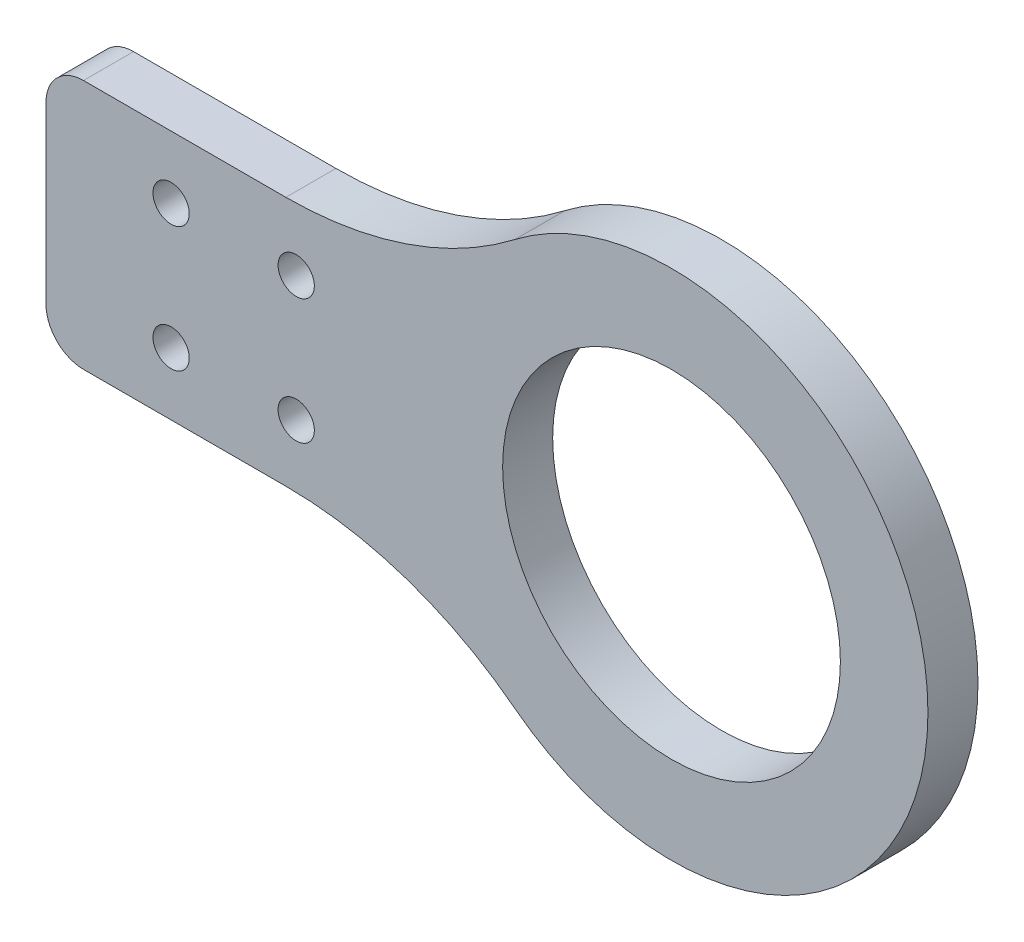
ISO-10303-21;
HEADER;
FILE_DESCRIPTION(('STEP AP214'),'2;1');
FILE_NAME('part.step','',(''),(''),'','','');
FILE_SCHEMA(('AUTOMOTIVE_DESIGN { 1 0 10303 214 1 1 1 1 }'));
ENDSEC;
DATA;
#1=APPLICATION_CONTEXT('core data for automotive mechanical design processes');
#2=APPLICATION_PROTOCOL_DEFINITION('international standard','automotive_design',2000,#1);
#3=PRODUCT_CONTEXT('',#1,'mechanical');
#4=PRODUCT('Part','Part','',(#3));
#5=PRODUCT_RELATED_PRODUCT_CATEGORY('part','',(#4));
#6=PRODUCT_DEFINITION_FORMATION('','',#4);
#7=PRODUCT_DEFINITION_CONTEXT('part definition',#1,'design');
#8=PRODUCT_DEFINITION('design','',#6,#7);
#9=PRODUCT_DEFINITION_SHAPE('','',#8);
#10=(LENGTH_UNIT() NAMED_UNIT(*) SI_UNIT(.MILLI.,.METRE.));
#11=(NAMED_UNIT(*) PLANE_ANGLE_UNIT() SI_UNIT($,.RADIAN.));
#12=(NAMED_UNIT(*) SI_UNIT($,.STERADIAN.) SOLID_ANGLE_UNIT());
#13=UNCERTAINTY_MEASURE_WITH_UNIT(LENGTH_MEASURE(1.E-05),#10,'distance_accuracy_value','');
#14=(GEOMETRIC_REPRESENTATION_CONTEXT(3) GLOBAL_UNCERTAINTY_ASSIGNED_CONTEXT((#13)) GLOBAL_UNIT_ASSIGNED_CONTEXT((#10,
#11,#12)) REPRESENTATION_CONTEXT('',''));
#15=CARTESIAN_POINT('',(0.,0.,0.));
#16=DIRECTION('',(0.,0.,1.));
#17=DIRECTION('',(1.,0.,0.));
#18=AXIS2_PLACEMENT_3D('',#15,#16,#17);
#19=CARTESIAN_POINT('',(17.8955301681733,-9.99999999999999,4.));
#20=DIRECTION('',(0.,0.,1.));
#21=DIRECTION('',(1.,0.,0.));
#22=AXIS2_PLACEMENT_3D('',#19,#20,#21);
#23=PLANE('',#22);
#24=CARTESIAN_POINT('',(-22.1044698318267,-15.,4.));
#25=DIRECTION('',(0.,0.,1.));
#26=DIRECTION('',(1.,0.,0.));
#27=AXIS2_PLACEMENT_3D('',#24,#25,#26);
#28=CIRCLE('',#27,1.45);
#29=CARTESIAN_POINT('',(-20.6544698318267,-15.,4.));
#30=VERTEX_POINT('',#29);
#31=EDGE_CURVE('E205',#30,#30,#28,.T.);
#32=ORIENTED_EDGE('',*,*,#31,.F.);
#33=EDGE_LOOP('',(#32));
#34=FACE_BOUND('',#33,.T.);
#35=CARTESIAN_POINT('',(-12.1044698318267,-15.,4.));
#36=DIRECTION('',(0.,0.,1.));
#37=DIRECTION('',(1.,0.,0.));
#38=AXIS2_PLACEMENT_3D('',#35,#36,#37);
#39=CIRCLE('',#38,1.45);
#40=CARTESIAN_POINT('',(-10.6544698318267,-15.,4.));
#41=VERTEX_POINT('',#40);
#42=EDGE_CURVE('E211',#41,#41,#39,.T.);
#43=ORIENTED_EDGE('',*,*,#42,.F.);
#44=EDGE_LOOP('',(#43));
#45=FACE_BOUND('',#44,.T.);
#46=CARTESIAN_POINT('',(-12.1044698318267,-5.,4.));
#47=DIRECTION('',(0.,0.,1.));
#48=DIRECTION('',(1.,0.,0.));
#49=AXIS2_PLACEMENT_3D('',#46,#47,#48);
#50=CIRCLE('',#49,1.45);
#51=CARTESIAN_POINT('',(-10.6544698318267,-5.,4.));
#52=VERTEX_POINT('',#51);
#53=EDGE_CURVE('E199',#52,#52,#50,.T.);
#54=ORIENTED_EDGE('',*,*,#53,.F.);
#55=EDGE_LOOP('',(#54));
#56=FACE_BOUND('',#55,.T.);
#57=CARTESIAN_POINT('',(-22.1044698318267,-5.,4.));
#58=DIRECTION('',(0.,0.,1.));
#59=DIRECTION('',(1.,0.,0.));
#60=AXIS2_PLACEMENT_3D('',#57,#58,#59);
#61=CIRCLE('',#60,1.45);
#62=CARTESIAN_POINT('',(-20.6544698318267,-5.,4.));
#63=VERTEX_POINT('',#62);
#64=EDGE_CURVE('E196',#63,#63,#61,.T.);
#65=ORIENTED_EDGE('',*,*,#64,.F.);
#66=EDGE_LOOP('',(#65));
#67=FACE_BOUND('',#66,.T.);
#68=DIRECTION('',(0.,-1.,0.));
#69=VECTOR('',#68,1.);
#70=CARTESIAN_POINT('',(-32.1044698318267,0.,4.));
#71=LINE('',#70,#69);
#72=CARTESIAN_POINT('',(-32.1044698318267,-3.,4.));
#73=VERTEX_POINT('',#72);
#74=CARTESIAN_POINT('',(-32.1044698318267,-17.,4.));
#75=VERTEX_POINT('',#74);
#76=EDGE_CURVE('E173',#73,#75,#71,.T.);
#77=ORIENTED_EDGE('',*,*,#76,.T.);
#78=CARTESIAN_POINT('',(-29.1044698318267,-17.,4.));
#79=DIRECTION('',(0.,0.,1.));
#80=DIRECTION('',(1.,0.,0.));
#81=AXIS2_PLACEMENT_3D('',#78,#79,#80);
#82=CIRCLE('',#81,3.);
#83=CARTESIAN_POINT('',(-29.1044698318267,-20.,4.));
#84=VERTEX_POINT('',#83);
#85=EDGE_CURVE('E47',#75,#84,#82,.T.);
#86=ORIENTED_EDGE('',*,*,#85,.T.);
#87=DIRECTION('',(1.,0.,0.));
#88=VECTOR('',#87,1.);
#89=CARTESIAN_POINT('',(-32.1044698318267,-20.,4.));
#90=LINE('',#89,#88);
#91=CARTESIAN_POINT('',(-12.9305951154234,-20.,4.));
#92=VERTEX_POINT('',#91);
#93=EDGE_CURVE('E143',#84,#92,#90,.T.);
#94=ORIENTED_EDGE('',*,*,#93,.T.);
#95=CARTESIAN_POINT('',(-12.9305951154234,-50.,4.));
#96=DIRECTION('',(0.,0.,1.));
#97=DIRECTION('',(1.,0.,0.));
#98=AXIS2_PLACEMENT_3D('',#95,#96,#97);
#99=CIRCLE('',#98,30.);
#100=CARTESIAN_POINT('',(5.38195455800037,-26.2376237623762,4.));
#101=VERTEX_POINT('',#100);
#102=EDGE_CURVE('E117',#92,#101,#99,.F.);
#103=ORIENTED_EDGE('',*,*,#102,.T.);
#104=CARTESIAN_POINT('',(17.8955301681733,-9.99999999999999,4.));
#105=DIRECTION('',(0.,0.,1.));
#106=DIRECTION('',(1.,0.,0.));
#107=AXIS2_PLACEMENT_3D('',#104,#105,#106);
#108=CIRCLE('',#107,20.5);
#109=CARTESIAN_POINT('',(5.38195455800036,6.23762376237624,4.));
#110=VERTEX_POINT('',#109);
#111=EDGE_CURVE('E127',#101,#110,#108,.T.);
#112=ORIENTED_EDGE('',*,*,#111,.T.);
#113=CARTESIAN_POINT('',(-12.9305951154234,30.,4.));
#114=DIRECTION('',(0.,0.,1.));
#115=DIRECTION('',(1.,0.,0.));
#116=AXIS2_PLACEMENT_3D('',#113,#114,#115);
#117=CIRCLE('',#116,30.);
#118=CARTESIAN_POINT('',(-12.9305951154234,0.,4.));
#119=VERTEX_POINT('',#118);
#120=EDGE_CURVE('E155',#110,#119,#117,.F.);
#121=ORIENTED_EDGE('',*,*,#120,.T.);
#122=DIRECTION('',(-1.,0.,0.));
#123=VECTOR('',#122,1.);
#124=CARTESIAN_POINT('',(0.,0.,4.));
#125=LINE('',#124,#123);
#126=CARTESIAN_POINT('',(-29.1044698318267,0.,4.));
#127=VERTEX_POINT('',#126);
#128=EDGE_CURVE('E186',#119,#127,#125,.T.);
#129=ORIENTED_EDGE('',*,*,#128,.T.);
#130=CARTESIAN_POINT('',(-29.1044698318267,-3.,4.));
#131=DIRECTION('',(0.,0.,1.));
#132=DIRECTION('',(1.,0.,0.));
#133=AXIS2_PLACEMENT_3D('',#130,#131,#132);
#134=CIRCLE('',#133,3.);
#135=EDGE_CURVE('E168',#127,#73,#134,.T.);
#136=ORIENTED_EDGE('',*,*,#135,.T.);
#137=EDGE_LOOP('',(#77,#86,#94,#103,#112,#121,#129,#136));
#138=FACE_BOUND('',#137,.T.);
#139=CARTESIAN_POINT('',(17.8955301681733,-9.99999999999999,4.));
#140=DIRECTION('',(0.,0.,1.));
#141=DIRECTION('',(1.,0.,0.));
#142=AXIS2_PLACEMENT_3D('',#139,#140,#141);
#143=CIRCLE('',#142,13.5);
#144=CARTESIAN_POINT('',(31.3955301681733,-9.99999999999999,4.));
#145=VERTEX_POINT('',#144);
#146=EDGE_CURVE('E135',#145,#145,#143,.T.);
#147=ORIENTED_EDGE('',*,*,#146,.F.);
#148=EDGE_LOOP('',(#147));
#149=FACE_BOUND('',#148,.T.);
#150=ADVANCED_FACE('F39',(#34,#45,#56,#67,#138,#149),#23,.T.);
#151=CARTESIAN_POINT('',(17.8955301681733,-9.99999999999999,0.));
#152=DIRECTION('',(0.,0.,1.));
#153=DIRECTION('',(1.,0.,0.));
#154=AXIS2_PLACEMENT_3D('',#151,#152,#153);
#155=PLANE('',#154);
#156=CARTESIAN_POINT('',(-22.1044698318267,-15.,0.));
#157=DIRECTION('',(0.,0.,1.));
#158=DIRECTION('',(1.,0.,0.));
#159=AXIS2_PLACEMENT_3D('',#156,#157,#158);
#160=CIRCLE('',#159,1.45);
#161=CARTESIAN_POINT('',(-20.6544698318267,-15.,0.));
#162=VERTEX_POINT('',#161);
#163=EDGE_CURVE('E202',#162,#162,#160,.T.);
#164=ORIENTED_EDGE('',*,*,#163,.T.);
#165=EDGE_LOOP('',(#164));
#166=FACE_BOUND('',#165,.T.);
#167=CARTESIAN_POINT('',(-12.1044698318267,-15.,0.));
#168=DIRECTION('',(0.,0.,1.));
#169=DIRECTION('',(1.,0.,0.));
#170=AXIS2_PLACEMENT_3D('',#167,#168,#169);
#171=CIRCLE('',#170,1.45);
#172=CARTESIAN_POINT('',(-10.6544698318267,-15.,0.));
#173=VERTEX_POINT('',#172);
#174=EDGE_CURVE('E208',#173,#173,#171,.T.);
#175=ORIENTED_EDGE('',*,*,#174,.T.);
#176=EDGE_LOOP('',(#175));
#177=FACE_BOUND('',#176,.T.);
#178=CARTESIAN_POINT('',(-12.1044698318267,-5.,0.));
#179=DIRECTION('',(0.,0.,1.));
#180=DIRECTION('',(1.,0.,0.));
#181=AXIS2_PLACEMENT_3D('',#178,#179,#180);
#182=CIRCLE('',#181,1.45);
#183=CARTESIAN_POINT('',(-10.6544698318267,-5.,0.));
#184=VERTEX_POINT('',#183);
#185=EDGE_CURVE('E214',#184,#184,#182,.T.);
#186=ORIENTED_EDGE('',*,*,#185,.T.);
#187=EDGE_LOOP('',(#186));
#188=FACE_BOUND('',#187,.T.);
#189=CARTESIAN_POINT('',(-22.1044698318267,-5.,0.));
#190=DIRECTION('',(0.,0.,1.));
#191=DIRECTION('',(1.,0.,0.));
#192=AXIS2_PLACEMENT_3D('',#189,#190,#191);
#193=CIRCLE('',#192,1.45);
#194=CARTESIAN_POINT('',(-20.6544698318267,-5.,0.));
#195=VERTEX_POINT('',#194);
#196=EDGE_CURVE('E194',#195,#195,#193,.T.);
#197=ORIENTED_EDGE('',*,*,#196,.T.);
#198=EDGE_LOOP('',(#197));
#199=FACE_BOUND('',#198,.T.);
#200=DIRECTION('',(1.,0.,0.));
#201=VECTOR('',#200,1.);
#202=CARTESIAN_POINT('',(-32.1044698318267,-20.,0.));
#203=LINE('',#202,#201);
#204=CARTESIAN_POINT('',(-29.1044698318267,-20.,0.));
#205=VERTEX_POINT('',#204);
#206=CARTESIAN_POINT('',(-12.9305951154234,-20.,0.));
#207=VERTEX_POINT('',#206);
#208=EDGE_CURVE('E147',#205,#207,#203,.T.);
#209=ORIENTED_EDGE('',*,*,#208,.F.);
#210=CARTESIAN_POINT('',(-29.1044698318267,-17.,0.));
#211=DIRECTION('',(0.,0.,1.));
#212=DIRECTION('',(1.,0.,0.));
#213=AXIS2_PLACEMENT_3D('',#210,#211,#212);
#214=CIRCLE('',#213,3.);
#215=CARTESIAN_POINT('',(-32.1044698318267,-17.,0.));
#216=VERTEX_POINT('',#215);
#217=EDGE_CURVE('E162',#205,#216,#214,.F.);
#218=ORIENTED_EDGE('',*,*,#217,.T.);
#219=DIRECTION('',(0.,-1.,0.));
#220=VECTOR('',#219,1.);
#221=CARTESIAN_POINT('',(-32.1044698318267,0.,0.));
#222=LINE('',#221,#220);
#223=CARTESIAN_POINT('',(-32.1044698318267,-3.,0.));
#224=VERTEX_POINT('',#223);
#225=EDGE_CURVE('E137',#224,#216,#222,.T.);
#226=ORIENTED_EDGE('',*,*,#225,.F.);
#227=CARTESIAN_POINT('',(-29.1044698318267,-3.,0.));
#228=DIRECTION('',(0.,0.,1.));
#229=DIRECTION('',(1.,0.,0.));
#230=AXIS2_PLACEMENT_3D('',#227,#228,#229);
#231=CIRCLE('',#230,3.);
#232=CARTESIAN_POINT('',(-29.1044698318267,0.,0.));
#233=VERTEX_POINT('',#232);
#234=EDGE_CURVE('E160',#224,#233,#231,.F.);
#235=ORIENTED_EDGE('',*,*,#234,.T.);
#236=DIRECTION('',(-1.,0.,0.));
#237=VECTOR('',#236,1.);
#238=CARTESIAN_POINT('',(0.,0.,0.));
#239=LINE('',#238,#237);
#240=CARTESIAN_POINT('',(-12.9305951154234,0.,0.));
#241=VERTEX_POINT('',#240);
#242=EDGE_CURVE('E134',#241,#233,#239,.T.);
#243=ORIENTED_EDGE('',*,*,#242,.F.);
#244=CARTESIAN_POINT('',(-12.9305951154234,30.,0.));
#245=DIRECTION('',(0.,0.,1.));
#246=DIRECTION('',(1.,0.,0.));
#247=AXIS2_PLACEMENT_3D('',#244,#245,#246);
#248=CIRCLE('',#247,30.);
#249=CARTESIAN_POINT('',(5.38195455800036,6.23762376237624,0.));
#250=VERTEX_POINT('',#249);
#251=EDGE_CURVE('E133',#241,#250,#248,.T.);
#252=ORIENTED_EDGE('',*,*,#251,.T.);
#253=CARTESIAN_POINT('',(17.8955301681733,-9.99999999999999,0.));
#254=DIRECTION('',(0.,0.,1.));
#255=DIRECTION('',(1.,0.,0.));
#256=AXIS2_PLACEMENT_3D('',#253,#254,#255);
#257=CIRCLE('',#256,20.5);
#258=CARTESIAN_POINT('',(5.38195455800037,-26.2376237623762,0.));
#259=VERTEX_POINT('',#258);
#260=EDGE_CURVE('E124',#259,#250,#257,.T.);
#261=ORIENTED_EDGE('',*,*,#260,.F.);
#262=CARTESIAN_POINT('',(-12.9305951154234,-50.,0.));
#263=DIRECTION('',(0.,0.,1.));
#264=DIRECTION('',(1.,0.,0.));
#265=AXIS2_PLACEMENT_3D('',#262,#263,#264);
#266=CIRCLE('',#265,30.);
#267=EDGE_CURVE('E107',#259,#207,#266,.T.);
#268=ORIENTED_EDGE('',*,*,#267,.T.);
#269=EDGE_LOOP('',(#209,#218,#226,#235,#243,#252,#261,#268));
#270=FACE_BOUND('',#269,.T.);
#271=CARTESIAN_POINT('',(17.8955301681733,-9.99999999999999,0.));
#272=DIRECTION('',(0.,0.,1.));
#273=DIRECTION('',(1.,0.,0.));
#274=AXIS2_PLACEMENT_3D('',#271,#272,#273);
#275=CIRCLE('',#274,13.5);
#276=CARTESIAN_POINT('',(31.3955301681733,-9.99999999999999,0.));
#277=VERTEX_POINT('',#276);
#278=EDGE_CURVE('E140',#277,#277,#275,.T.);
#279=ORIENTED_EDGE('',*,*,#278,.T.);
#280=EDGE_LOOP('',(#279));
#281=FACE_BOUND('',#280,.T.);
#282=ADVANCED_FACE('F130',(#166,#177,#188,#199,#270,#281),#155,.F.);
#283=CARTESIAN_POINT('',(17.8955301681733,-9.99999999999999,4.));
#284=DIRECTION('',(0.,0.,-1.));
#285=DIRECTION('',(-1.,0.,0.));
#286=AXIS2_PLACEMENT_3D('',#283,#284,#285);
#287=CYLINDRICAL_SURFACE('',#286,20.5);
#288=ORIENTED_EDGE('',*,*,#111,.F.);
#289=DIRECTION('',(0.,0.,-1.));
#290=VECTOR('',#289,1.);
#291=CARTESIAN_POINT('',(5.38195455800037,-26.2376237623762,4.));
#292=LINE('',#291,#290);
#293=EDGE_CURVE('E111',#101,#259,#292,.T.);
#294=ORIENTED_EDGE('',*,*,#293,.T.);
#295=ORIENTED_EDGE('',*,*,#260,.T.);
#296=DIRECTION('',(0.,0.,-1.));
#297=VECTOR('',#296,1.);
#298=CARTESIAN_POINT('',(5.38195455800036,6.23762376237624,4.));
#299=LINE('',#298,#297);
#300=EDGE_CURVE('E128',#250,#110,#299,.F.);
#301=ORIENTED_EDGE('',*,*,#300,.T.);
#302=EDGE_LOOP('',(#288,#294,#295,#301));
#303=FACE_BOUND('',#302,.T.);
#304=ADVANCED_FACE('F123',(#303),#287,.T.);
#305=CARTESIAN_POINT('',(0.,0.,4.));
#306=DIRECTION('',(0.,-1.,0.));
#307=DIRECTION('',(1.,0.,0.));
#308=AXIS2_PLACEMENT_3D('',#305,#306,#307);
#309=PLANE('',#308);
#310=ORIENTED_EDGE('',*,*,#242,.T.);
#311=DIRECTION('',(0.,0.,-1.));
#312=VECTOR('',#311,1.);
#313=CARTESIAN_POINT('',(-29.1044698318267,0.,4.));
#314=LINE('',#313,#312);
#315=EDGE_CURVE('E11',#233,#127,#314,.F.);
#316=ORIENTED_EDGE('',*,*,#315,.T.);
#317=ORIENTED_EDGE('',*,*,#128,.F.);
#318=DIRECTION('',(0.,0.,1.));
#319=VECTOR('',#318,1.);
#320=CARTESIAN_POINT('',(-12.9305951154234,0.,0.));
#321=LINE('',#320,#319);
#322=EDGE_CURVE('E118',#119,#241,#321,.F.);
#323=ORIENTED_EDGE('',*,*,#322,.T.);
#324=EDGE_LOOP('',(#310,#316,#317,#323));
#325=FACE_BOUND('',#324,.T.);
#326=ADVANCED_FACE('F184',(#325),#309,.F.);
#327=CARTESIAN_POINT('',(-32.1044698318267,0.,4.));
#328=DIRECTION('',(1.,0.,0.));
#329=DIRECTION('',(0.,0.,-1.));
#330=AXIS2_PLACEMENT_3D('',#327,#328,#329);
#331=PLANE('',#330);
#332=ORIENTED_EDGE('',*,*,#225,.T.);
#333=DIRECTION('',(0.,0.,-1.));
#334=VECTOR('',#333,1.);
#335=CARTESIAN_POINT('',(-32.1044698318267,-17.,4.));
#336=LINE('',#335,#334);
#337=EDGE_CURVE('E60',#216,#75,#336,.F.);
#338=ORIENTED_EDGE('',*,*,#337,.T.);
#339=ORIENTED_EDGE('',*,*,#76,.F.);
#340=DIRECTION('',(0.,0.,-1.));
#341=VECTOR('',#340,1.);
#342=CARTESIAN_POINT('',(-32.1044698318267,-3.,4.));
#343=LINE('',#342,#341);
#344=EDGE_CURVE('E164',#73,#224,#343,.T.);
#345=ORIENTED_EDGE('',*,*,#344,.T.);
#346=EDGE_LOOP('',(#332,#338,#339,#345));
#347=FACE_BOUND('',#346,.T.);
#348=ADVANCED_FACE('F180',(#347),#331,.F.);
#349=CARTESIAN_POINT('',(-32.1044698318267,-20.,4.));
#350=DIRECTION('',(0.,1.,0.));
#351=DIRECTION('',(0.,0.,1.));
#352=AXIS2_PLACEMENT_3D('',#349,#350,#351);
#353=PLANE('',#352);
#354=ORIENTED_EDGE('',*,*,#93,.F.);
#355=DIRECTION('',(0.,0.,-1.));
#356=VECTOR('',#355,1.);
#357=CARTESIAN_POINT('',(-29.1044698318267,-20.,4.));
#358=LINE('',#357,#356);
#359=EDGE_CURVE('E157',#84,#205,#358,.T.);
#360=ORIENTED_EDGE('',*,*,#359,.T.);
#361=ORIENTED_EDGE('',*,*,#208,.T.);
#362=DIRECTION('',(0.,0.,1.));
#363=VECTOR('',#362,1.);
#364=CARTESIAN_POINT('',(-12.9305951154234,-20.,4.));
#365=LINE('',#364,#363);
#366=EDGE_CURVE('E113',#207,#92,#365,.T.);
#367=ORIENTED_EDGE('',*,*,#366,.T.);
#368=EDGE_LOOP('',(#354,#360,#361,#367));
#369=FACE_BOUND('',#368,.T.);
#370=ADVANCED_FACE('F177',(#369),#353,.F.);
#371=CARTESIAN_POINT('',(17.8955301681733,-9.99999999999999,4.));
#372=DIRECTION('',(0.,0.,-1.));
#373=DIRECTION('',(-1.,0.,0.));
#374=AXIS2_PLACEMENT_3D('',#371,#372,#373);
#375=CYLINDRICAL_SURFACE('',#374,13.5);
#376=ORIENTED_EDGE('',*,*,#146,.T.);
#377=EDGE_LOOP('',(#376));
#378=FACE_BOUND('',#377,.T.);
#379=ORIENTED_EDGE('',*,*,#278,.F.);
#380=EDGE_LOOP('',(#379));
#381=FACE_BOUND('',#380,.T.);
#382=ADVANCED_FACE('F230',(#378,#381),#375,.F.);
#383=CARTESIAN_POINT('',(-22.1044698318267,-5.,0.));
#384=DIRECTION('',(0.,0.,1.));
#385=DIRECTION('',(1.,0.,0.));
#386=AXIS2_PLACEMENT_3D('',#383,#384,#385);
#387=CYLINDRICAL_SURFACE('',#386,1.45);
#388=ORIENTED_EDGE('',*,*,#196,.F.);
#389=EDGE_LOOP('',(#388));
#390=FACE_BOUND('',#389,.T.);
#391=ORIENTED_EDGE('',*,*,#64,.T.);
#392=EDGE_LOOP('',(#391));
#393=FACE_BOUND('',#392,.T.);
#394=ADVANCED_FACE('F228',(#390,#393),#387,.F.);
#395=CARTESIAN_POINT('',(-12.1044698318267,-5.,0.));
#396=DIRECTION('',(0.,0.,1.));
#397=DIRECTION('',(1.,0.,0.));
#398=AXIS2_PLACEMENT_3D('',#395,#396,#397);
#399=CYLINDRICAL_SURFACE('',#398,1.45);
#400=ORIENTED_EDGE('',*,*,#185,.F.);
#401=EDGE_LOOP('',(#400));
#402=FACE_BOUND('',#401,.T.);
#403=ORIENTED_EDGE('',*,*,#53,.T.);
#404=EDGE_LOOP('',(#403));
#405=FACE_BOUND('',#404,.T.);
#406=ADVANCED_FACE('F220',(#402,#405),#399,.F.);
#407=CARTESIAN_POINT('',(-12.1044698318267,-15.,0.));
#408=DIRECTION('',(0.,0.,1.));
#409=DIRECTION('',(1.,0.,0.));
#410=AXIS2_PLACEMENT_3D('',#407,#408,#409);
#411=CYLINDRICAL_SURFACE('',#410,1.45);
#412=ORIENTED_EDGE('',*,*,#174,.F.);
#413=EDGE_LOOP('',(#412));
#414=FACE_BOUND('',#413,.T.);
#415=ORIENTED_EDGE('',*,*,#42,.T.);
#416=EDGE_LOOP('',(#415));
#417=FACE_BOUND('',#416,.T.);
#418=ADVANCED_FACE('F237',(#414,#417),#411,.F.);
#419=CARTESIAN_POINT('',(-22.1044698318267,-15.,0.));
#420=DIRECTION('',(0.,0.,1.));
#421=DIRECTION('',(1.,0.,0.));
#422=AXIS2_PLACEMENT_3D('',#419,#420,#421);
#423=CYLINDRICAL_SURFACE('',#422,1.45);
#424=ORIENTED_EDGE('',*,*,#163,.F.);
#425=EDGE_LOOP('',(#424));
#426=FACE_BOUND('',#425,.T.);
#427=ORIENTED_EDGE('',*,*,#31,.T.);
#428=EDGE_LOOP('',(#427));
#429=FACE_BOUND('',#428,.T.);
#430=ADVANCED_FACE('F244',(#426,#429),#423,.F.);
#431=CARTESIAN_POINT('',(-12.9305951154234,-50.,4.));
#432=DIRECTION('',(0.,0.,-1.));
#433=DIRECTION('',(-1.,0.,0.));
#434=AXIS2_PLACEMENT_3D('',#431,#432,#433);
#435=CYLINDRICAL_SURFACE('',#434,30.);
#436=ORIENTED_EDGE('',*,*,#102,.F.);
#437=ORIENTED_EDGE('',*,*,#366,.F.);
#438=ORIENTED_EDGE('',*,*,#267,.F.);
#439=ORIENTED_EDGE('',*,*,#293,.F.);
#440=EDGE_LOOP('',(#436,#437,#438,#439));
#441=FACE_BOUND('',#440,.T.);
#442=ADVANCED_FACE('F110',(#441),#435,.F.);
#443=CARTESIAN_POINT('',(-12.9305951154234,30.,4.));
#444=DIRECTION('',(0.,0.,-1.));
#445=DIRECTION('',(-1.,0.,0.));
#446=AXIS2_PLACEMENT_3D('',#443,#444,#445);
#447=CYLINDRICAL_SURFACE('',#446,30.);
#448=ORIENTED_EDGE('',*,*,#120,.F.);
#449=ORIENTED_EDGE('',*,*,#300,.F.);
#450=ORIENTED_EDGE('',*,*,#251,.F.);
#451=ORIENTED_EDGE('',*,*,#322,.F.);
#452=EDGE_LOOP('',(#448,#449,#450,#451));
#453=FACE_BOUND('',#452,.T.);
#454=ADVANCED_FACE('F189',(#453),#447,.F.);
#455=CARTESIAN_POINT('',(-29.1044698318267,-17.,4.));
#456=DIRECTION('',(0.,0.,-1.));
#457=DIRECTION('',(-1.,0.,0.));
#458=AXIS2_PLACEMENT_3D('',#455,#456,#457);
#459=CYLINDRICAL_SURFACE('',#458,3.);
#460=ORIENTED_EDGE('',*,*,#85,.F.);
#461=ORIENTED_EDGE('',*,*,#337,.F.);
#462=ORIENTED_EDGE('',*,*,#217,.F.);
#463=ORIENTED_EDGE('',*,*,#359,.F.);
#464=EDGE_LOOP('',(#460,#461,#462,#463));
#465=FACE_BOUND('',#464,.T.);
#466=ADVANCED_FACE('F178',(#465),#459,.T.);
#467=CARTESIAN_POINT('',(-29.1044698318267,-3.,4.));
#468=DIRECTION('',(0.,0.,-1.));
#469=DIRECTION('',(-1.,0.,0.));
#470=AXIS2_PLACEMENT_3D('',#467,#468,#469);
#471=CYLINDRICAL_SURFACE('',#470,3.);
#472=ORIENTED_EDGE('',*,*,#135,.F.);
#473=ORIENTED_EDGE('',*,*,#315,.F.);
#474=ORIENTED_EDGE('',*,*,#234,.F.);
#475=ORIENTED_EDGE('',*,*,#344,.F.);
#476=EDGE_LOOP('',(#472,#473,#474,#475));
#477=FACE_BOUND('',#476,.T.);
#478=ADVANCED_FACE('F41',(#477),#471,.T.);
#479=CLOSED_SHELL('',(#150,#282,#304,#326,#348,#370,#382,#394,#406,#418,#430,#442,#454,#466,#478));
#480=MANIFOLD_SOLID_BREP('B2',#479);
#481=ADVANCED_BREP_SHAPE_REPRESENTATION('',(#18,#480),#14);
#482=SHAPE_DEFINITION_REPRESENTATION(#9,#481);
ENDSEC;
END-ISO-10303-21;
